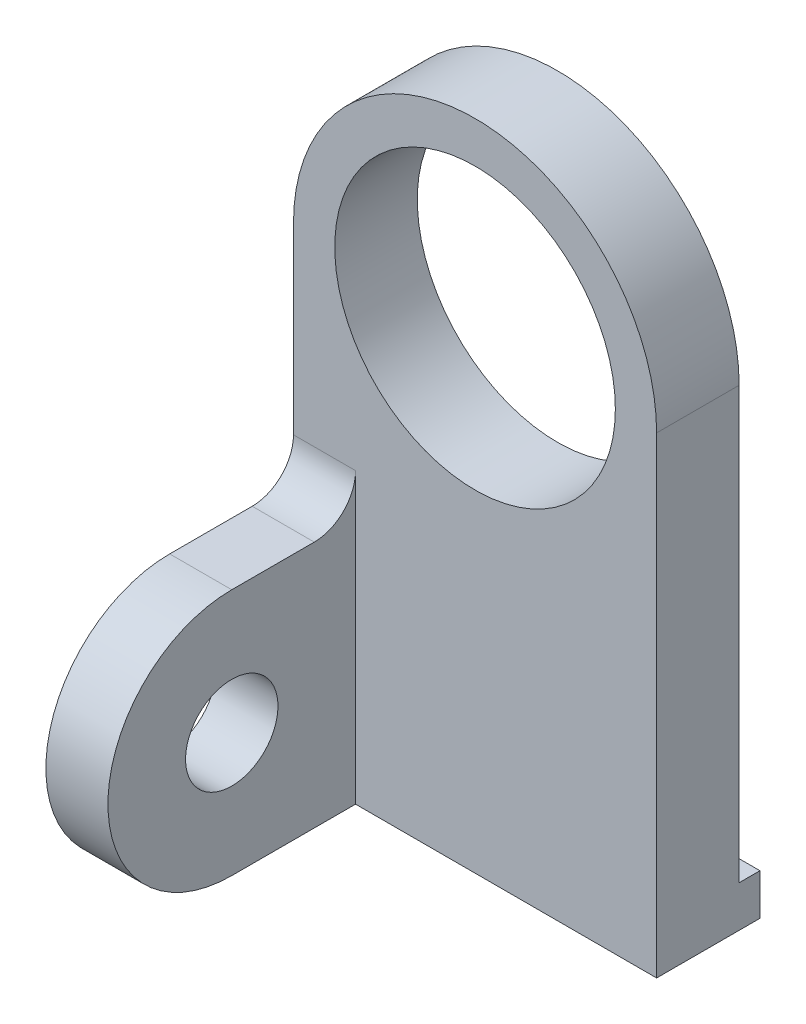
ISO-10303-21;
HEADER;
FILE_DESCRIPTION(('STEP AP214'),'2;1');
FILE_NAME('part.step','',(''),(''),'','','');
FILE_SCHEMA(('AUTOMOTIVE_DESIGN { 1 0 10303 214 1 1 1 1 }'));
ENDSEC;
DATA;
#1=APPLICATION_CONTEXT('core data for automotive mechanical design processes');
#2=APPLICATION_PROTOCOL_DEFINITION('international standard','automotive_design',2000,#1);
#3=PRODUCT_CONTEXT('',#1,'mechanical');
#4=PRODUCT('Part','Part','',(#3));
#5=PRODUCT_RELATED_PRODUCT_CATEGORY('part','',(#4));
#6=PRODUCT_DEFINITION_FORMATION('','',#4);
#7=PRODUCT_DEFINITION_CONTEXT('part definition',#1,'design');
#8=PRODUCT_DEFINITION('design','',#6,#7);
#9=PRODUCT_DEFINITION_SHAPE('','',#8);
#10=(LENGTH_UNIT() NAMED_UNIT(*) SI_UNIT(.MILLI.,.METRE.));
#11=(NAMED_UNIT(*) PLANE_ANGLE_UNIT() SI_UNIT($,.RADIAN.));
#12=(NAMED_UNIT(*) SI_UNIT($,.STERADIAN.) SOLID_ANGLE_UNIT());
#13=UNCERTAINTY_MEASURE_WITH_UNIT(LENGTH_MEASURE(1.E-05),#10,'distance_accuracy_value','');
#14=(GEOMETRIC_REPRESENTATION_CONTEXT(3) GLOBAL_UNCERTAINTY_ASSIGNED_CONTEXT((#13)) GLOBAL_UNIT_ASSIGNED_CONTEXT((#10,
#11,#12)) REPRESENTATION_CONTEXT('',''));
#15=CARTESIAN_POINT('',(0.,0.,0.));
#16=DIRECTION('',(0.,0.,1.));
#17=DIRECTION('',(1.,0.,0.));
#18=AXIS2_PLACEMENT_3D('',#15,#16,#17);
#19=CARTESIAN_POINT('',(0.,0.,6.35));
#20=DIRECTION('',(0.,0.,1.));
#21=DIRECTION('',(1.,0.,0.));
#22=AXIS2_PLACEMENT_3D('',#19,#20,#21);
#23=PLANE('',#22);
#24=DIRECTION('',(0.,-1.,0.));
#25=VECTOR('',#24,1.);
#26=CARTESIAN_POINT('',(-13.97,0.,6.35));
#27=LINE('',#26,#25);
#28=CARTESIAN_POINT('',(-13.97,0.,6.35));
#29=VERTEX_POINT('',#28);
#30=CARTESIAN_POINT('',(-13.97,-14.097,6.35));
#31=VERTEX_POINT('',#30);
#32=EDGE_CURVE('E177',#29,#31,#27,.T.);
#33=ORIENTED_EDGE('',*,*,#32,.T.);
#34=DIRECTION('',(-1.,0.,0.));
#35=VECTOR('',#34,1.);
#36=CARTESIAN_POINT('',(-9.1948,-14.097,6.35));
#37=LINE('',#36,#35);
#38=CARTESIAN_POINT('',(-9.1948,-14.097,6.35));
#39=VERTEX_POINT('',#38);
#40=EDGE_CURVE('E198',#31,#39,#37,.F.);
#41=ORIENTED_EDGE('',*,*,#40,.T.);
#42=DIRECTION('',(0.,-1.,0.));
#43=VECTOR('',#42,1.);
#44=CARTESIAN_POINT('',(-9.1948,-17.272,6.35));
#45=LINE('',#44,#43);
#46=CARTESIAN_POINT('',(-9.1948,-36.322,6.35));
#47=VERTEX_POINT('',#46);
#48=EDGE_CURVE('E47',#39,#47,#45,.T.);
#49=ORIENTED_EDGE('',*,*,#48,.T.);
#50=DIRECTION('',(1.,0.,0.));
#51=VECTOR('',#50,1.);
#52=CARTESIAN_POINT('',(-13.97,-36.322,6.35));
#53=LINE('',#52,#51);
#54=CARTESIAN_POINT('',(13.97,-36.322,6.35));
#55=VERTEX_POINT('',#54);
#56=EDGE_CURVE('E141',#47,#55,#53,.T.);
#57=ORIENTED_EDGE('',*,*,#56,.T.);
#58=DIRECTION('',(0.,1.,0.));
#59=VECTOR('',#58,1.);
#60=CARTESIAN_POINT('',(13.97,0.,6.35));
#61=LINE('',#60,#59);
#62=CARTESIAN_POINT('',(13.97,0.,6.35));
#63=VERTEX_POINT('',#62);
#64=EDGE_CURVE('E180',#55,#63,#61,.T.);
#65=ORIENTED_EDGE('',*,*,#64,.T.);
#66=CARTESIAN_POINT('',(0.,0.,6.35));
#67=DIRECTION('',(0.,0.,1.));
#68=DIRECTION('',(1.,0.,0.));
#69=AXIS2_PLACEMENT_3D('',#66,#67,#68);
#70=CIRCLE('',#69,13.97);
#71=EDGE_CURVE('E174',#63,#29,#70,.T.);
#72=ORIENTED_EDGE('',*,*,#71,.T.);
#73=EDGE_LOOP('',(#33,#41,#49,#57,#65,#72));
#74=FACE_BOUND('',#73,.T.);
#75=CARTESIAN_POINT('',(0.,0.,6.35));
#76=DIRECTION('',(0.,0.,1.));
#77=DIRECTION('',(1.,0.,0.));
#78=AXIS2_PLACEMENT_3D('',#75,#76,#77);
#79=CIRCLE('',#78,10.795);
#80=CARTESIAN_POINT('',(10.795,0.,6.35));
#81=VERTEX_POINT('',#80);
#82=EDGE_CURVE('E168',#81,#81,#79,.T.);
#83=ORIENTED_EDGE('',*,*,#82,.F.);
#84=EDGE_LOOP('',(#83));
#85=FACE_BOUND('',#84,.T.);
#86=ADVANCED_FACE('F33',(#74,#85),#23,.T.);
#87=CARTESIAN_POINT('',(0.,0.,0.));
#88=DIRECTION('',(0.,0.,1.));
#89=DIRECTION('',(1.,0.,0.));
#90=AXIS2_PLACEMENT_3D('',#87,#88,#89);
#91=PLANE('',#90);
#92=CARTESIAN_POINT('',(0.,0.,0.));
#93=DIRECTION('',(0.,0.,1.));
#94=DIRECTION('',(1.,0.,0.));
#95=AXIS2_PLACEMENT_3D('',#92,#93,#94);
#96=CIRCLE('',#95,13.97);
#97=CARTESIAN_POINT('',(13.97,0.,0.));
#98=VERTEX_POINT('',#97);
#99=CARTESIAN_POINT('',(-13.97,0.,0.));
#100=VERTEX_POINT('',#99);
#101=EDGE_CURVE('E171',#98,#100,#96,.T.);
#102=ORIENTED_EDGE('',*,*,#101,.F.);
#103=DIRECTION('',(0.,1.,0.));
#104=VECTOR('',#103,1.);
#105=CARTESIAN_POINT('',(13.97,0.,0.));
#106=LINE('',#105,#104);
#107=CARTESIAN_POINT('',(13.97,-33.147,0.));
#108=VERTEX_POINT('',#107);
#109=EDGE_CURVE('E178',#108,#98,#106,.T.);
#110=ORIENTED_EDGE('',*,*,#109,.F.);
#111=DIRECTION('',(1.,0.,0.));
#112=VECTOR('',#111,1.);
#113=CARTESIAN_POINT('',(-13.97,-33.147,0.));
#114=LINE('',#113,#112);
#115=CARTESIAN_POINT('',(-13.97,-33.147,0.));
#116=VERTEX_POINT('',#115);
#117=EDGE_CURVE('E187',#116,#108,#114,.T.);
#118=ORIENTED_EDGE('',*,*,#117,.F.);
#119=DIRECTION('',(0.,-1.,0.));
#120=VECTOR('',#119,1.);
#121=CARTESIAN_POINT('',(-13.97,0.,0.));
#122=LINE('',#121,#120);
#123=EDGE_CURVE('E185',#100,#116,#122,.T.);
#124=ORIENTED_EDGE('',*,*,#123,.F.);
#125=EDGE_LOOP('',(#102,#110,#118,#124));
#126=FACE_BOUND('',#125,.T.);
#127=CARTESIAN_POINT('',(0.,0.,0.));
#128=DIRECTION('',(0.,0.,1.));
#129=DIRECTION('',(1.,0.,0.));
#130=AXIS2_PLACEMENT_3D('',#127,#128,#129);
#131=CIRCLE('',#130,10.795);
#132=CARTESIAN_POINT('',(10.795,0.,0.));
#133=VERTEX_POINT('',#132);
#134=EDGE_CURVE('E160',#133,#133,#131,.T.);
#135=ORIENTED_EDGE('',*,*,#134,.T.);
#136=EDGE_LOOP('',(#135));
#137=FACE_BOUND('',#136,.T.);
#138=ADVANCED_FACE('F222',(#126,#137),#91,.F.);
#139=CARTESIAN_POINT('',(0.,0.,6.35));
#140=DIRECTION('',(0.,0.,-1.));
#141=DIRECTION('',(-1.,0.,0.));
#142=AXIS2_PLACEMENT_3D('',#139,#140,#141);
#143=CYLINDRICAL_SURFACE('',#142,13.97);
#144=ORIENTED_EDGE('',*,*,#101,.T.);
#145=DIRECTION('',(0.,0.,-1.));
#146=VECTOR('',#145,1.);
#147=CARTESIAN_POINT('',(-13.97,0.,6.35));
#148=LINE('',#147,#146);
#149=EDGE_CURVE('E193',#29,#100,#148,.T.);
#150=ORIENTED_EDGE('',*,*,#149,.F.);
#151=ORIENTED_EDGE('',*,*,#71,.F.);
#152=DIRECTION('',(0.,0.,-1.));
#153=VECTOR('',#152,1.);
#154=CARTESIAN_POINT('',(13.97,0.,6.35));
#155=LINE('',#154,#153);
#156=EDGE_CURVE('E182',#63,#98,#155,.T.);
#157=ORIENTED_EDGE('',*,*,#156,.T.);
#158=EDGE_LOOP('',(#144,#150,#151,#157));
#159=FACE_BOUND('',#158,.T.);
#160=ADVANCED_FACE('F219',(#159),#143,.T.);
#161=CARTESIAN_POINT('',(-13.97,0.,6.35));
#162=DIRECTION('',(1.,0.,0.));
#163=DIRECTION('',(0.,0.,-1.));
#164=AXIS2_PLACEMENT_3D('',#161,#162,#163);
#165=PLANE('',#164);
#166=ORIENTED_EDGE('',*,*,#123,.T.);
#167=DIRECTION('',(0.,0.,1.));
#168=VECTOR('',#167,1.);
#169=CARTESIAN_POINT('',(-13.97,-33.147,-1.6002));
#170=LINE('',#169,#168);
#171=CARTESIAN_POINT('',(-13.97,-33.147,-1.6002));
#172=VERTEX_POINT('',#171);
#173=EDGE_CURVE('E157',#172,#116,#170,.T.);
#174=ORIENTED_EDGE('',*,*,#173,.F.);
#175=DIRECTION('',(0.,-1.,0.));
#176=VECTOR('',#175,1.);
#177=CARTESIAN_POINT('',(-13.97,-33.147,-1.6002));
#178=LINE('',#177,#176);
#179=CARTESIAN_POINT('',(-13.97,-36.322,-1.6002));
#180=VERTEX_POINT('',#179);
#181=EDGE_CURVE('E143',#172,#180,#178,.T.);
#182=ORIENTED_EDGE('',*,*,#181,.T.);
#183=DIRECTION('',(0.,0.,1.));
#184=VECTOR('',#183,1.);
#185=CARTESIAN_POINT('',(-13.97,-36.322,-1.6002));
#186=LINE('',#185,#184);
#187=CARTESIAN_POINT('',(-13.97,-36.322,15.875));
#188=VERTEX_POINT('',#187);
#189=EDGE_CURVE('E155',#180,#188,#186,.T.);
#190=ORIENTED_EDGE('',*,*,#189,.T.);
#191=CARTESIAN_POINT('',(-13.97,-26.797,15.875));
#192=DIRECTION('',(-1.,0.,0.));
#193=DIRECTION('',(0.,0.,1.));
#194=AXIS2_PLACEMENT_3D('',#191,#192,#193);
#195=CIRCLE('',#194,9.525);
#196=CARTESIAN_POINT('',(-13.97,-17.272,15.875));
#197=VERTEX_POINT('',#196);
#198=EDGE_CURVE('E131',#188,#197,#195,.T.);
#199=ORIENTED_EDGE('',*,*,#198,.T.);
#200=DIRECTION('',(0.,0.,-1.));
#201=VECTOR('',#200,1.);
#202=CARTESIAN_POINT('',(-13.97,-17.272,15.875));
#203=LINE('',#202,#201);
#204=CARTESIAN_POINT('',(-13.97,-17.272,9.525));
#205=VERTEX_POINT('',#204);
#206=EDGE_CURVE('E114',#197,#205,#203,.T.);
#207=ORIENTED_EDGE('',*,*,#206,.T.);
#208=CARTESIAN_POINT('',(-13.97,-14.097,9.525));
#209=DIRECTION('',(1.,0.,0.));
#210=DIRECTION('',(0.,0.,-1.));
#211=AXIS2_PLACEMENT_3D('',#208,#209,#210);
#212=CIRCLE('',#211,3.175);
#213=EDGE_CURVE('E41',#205,#31,#212,.T.);
#214=ORIENTED_EDGE('',*,*,#213,.T.);
#215=ORIENTED_EDGE('',*,*,#32,.F.);
#216=ORIENTED_EDGE('',*,*,#149,.T.);
#217=EDGE_LOOP('',(#166,#174,#182,#190,#199,#207,#214,#215,#216));
#218=FACE_BOUND('',#217,.T.);
#219=CARTESIAN_POINT('',(-13.97,-26.797,15.875));
#220=DIRECTION('',(-1.,0.,0.));
#221=DIRECTION('',(0.,0.,1.));
#222=AXIS2_PLACEMENT_3D('',#219,#220,#221);
#223=CIRCLE('',#222,3.556);
#224=CARTESIAN_POINT('',(-13.97,-26.797,19.431));
#225=VERTEX_POINT('',#224);
#226=EDGE_CURVE('E134',#225,#225,#223,.T.);
#227=ORIENTED_EDGE('',*,*,#226,.F.);
#228=EDGE_LOOP('',(#227));
#229=FACE_BOUND('',#228,.T.);
#230=ADVANCED_FACE('F204',(#218,#229),#165,.F.);
#231=CARTESIAN_POINT('',(13.97,0.,6.35));
#232=DIRECTION('',(-1.,0.,0.));
#233=DIRECTION('',(0.,0.,1.));
#234=AXIS2_PLACEMENT_3D('',#231,#232,#233);
#235=PLANE('',#234);
#236=ORIENTED_EDGE('',*,*,#109,.T.);
#237=ORIENTED_EDGE('',*,*,#156,.F.);
#238=ORIENTED_EDGE('',*,*,#64,.F.);
#239=DIRECTION('',(0.,0.,1.));
#240=VECTOR('',#239,1.);
#241=CARTESIAN_POINT('',(13.97,-36.322,-1.6002));
#242=LINE('',#241,#240);
#243=CARTESIAN_POINT('',(13.97,-36.322,-1.6002));
#244=VERTEX_POINT('',#243);
#245=EDGE_CURVE('E164',#244,#55,#242,.T.);
#246=ORIENTED_EDGE('',*,*,#245,.F.);
#247=DIRECTION('',(0.,1.,0.));
#248=VECTOR('',#247,1.);
#249=CARTESIAN_POINT('',(13.97,-33.147,-1.6002));
#250=LINE('',#249,#248);
#251=CARTESIAN_POINT('',(13.97,-33.147,-1.6002));
#252=VERTEX_POINT('',#251);
#253=EDGE_CURVE('E149',#244,#252,#250,.T.);
#254=ORIENTED_EDGE('',*,*,#253,.T.);
#255=DIRECTION('',(0.,0.,1.));
#256=VECTOR('',#255,1.);
#257=CARTESIAN_POINT('',(13.97,-33.147,-1.6002));
#258=LINE('',#257,#256);
#259=EDGE_CURVE('E161',#252,#108,#258,.T.);
#260=ORIENTED_EDGE('',*,*,#259,.T.);
#261=EDGE_LOOP('',(#236,#237,#238,#246,#254,#260));
#262=FACE_BOUND('',#261,.T.);
#263=ADVANCED_FACE('F213',(#262),#235,.F.);
#264=CARTESIAN_POINT('',(0.,0.,6.35));
#265=DIRECTION('',(0.,0.,-1.));
#266=DIRECTION('',(-1.,0.,0.));
#267=AXIS2_PLACEMENT_3D('',#264,#265,#266);
#268=CYLINDRICAL_SURFACE('',#267,10.795);
#269=ORIENTED_EDGE('',*,*,#82,.T.);
#270=EDGE_LOOP('',(#269));
#271=FACE_BOUND('',#270,.T.);
#272=ORIENTED_EDGE('',*,*,#134,.F.);
#273=EDGE_LOOP('',(#272));
#274=FACE_BOUND('',#273,.T.);
#275=ADVANCED_FACE('F249',(#271,#274),#268,.F.);
#276=CARTESIAN_POINT('',(-13.97,-33.147,-1.6002));
#277=DIRECTION('',(0.,1.,0.));
#278=DIRECTION('',(0.,0.,1.));
#279=AXIS2_PLACEMENT_3D('',#276,#277,#278);
#280=PLANE('',#279);
#281=ORIENTED_EDGE('',*,*,#173,.T.);
#282=ORIENTED_EDGE('',*,*,#117,.T.);
#283=ORIENTED_EDGE('',*,*,#259,.F.);
#284=DIRECTION('',(-1.,0.,0.));
#285=VECTOR('',#284,1.);
#286=CARTESIAN_POINT('',(-13.97,-33.147,-1.6002));
#287=LINE('',#286,#285);
#288=EDGE_CURVE('E152',#252,#172,#287,.T.);
#289=ORIENTED_EDGE('',*,*,#288,.T.);
#290=EDGE_LOOP('',(#281,#282,#283,#289));
#291=FACE_BOUND('',#290,.T.);
#292=ADVANCED_FACE('F225',(#291),#280,.T.);
#293=CARTESIAN_POINT('',(-13.97,-36.322,-1.6002));
#294=DIRECTION('',(0.,-1.,0.));
#295=DIRECTION('',(0.,0.,-1.));
#296=AXIS2_PLACEMENT_3D('',#293,#294,#295);
#297=PLANE('',#296);
#298=ORIENTED_EDGE('',*,*,#56,.F.);
#299=DIRECTION('',(0.,0.,1.));
#300=VECTOR('',#299,1.);
#301=CARTESIAN_POINT('',(-9.1948,-36.322,6.35));
#302=LINE('',#301,#300);
#303=CARTESIAN_POINT('',(-9.1948,-36.322,15.875));
#304=VERTEX_POINT('',#303);
#305=EDGE_CURVE('E120',#47,#304,#302,.T.);
#306=ORIENTED_EDGE('',*,*,#305,.T.);
#307=DIRECTION('',(-1.,0.,0.));
#308=VECTOR('',#307,1.);
#309=CARTESIAN_POINT('',(-9.1948,-36.322,15.875));
#310=LINE('',#309,#308);
#311=EDGE_CURVE('E119',#304,#188,#310,.T.);
#312=ORIENTED_EDGE('',*,*,#311,.T.);
#313=ORIENTED_EDGE('',*,*,#189,.F.);
#314=DIRECTION('',(1.,0.,0.));
#315=VECTOR('',#314,1.);
#316=CARTESIAN_POINT('',(-13.97,-36.322,-1.6002));
#317=LINE('',#316,#315);
#318=EDGE_CURVE('E146',#180,#244,#317,.T.);
#319=ORIENTED_EDGE('',*,*,#318,.T.);
#320=ORIENTED_EDGE('',*,*,#245,.T.);
#321=EDGE_LOOP('',(#298,#306,#312,#313,#319,#320));
#322=FACE_BOUND('',#321,.T.);
#323=ADVANCED_FACE('F209',(#322),#297,.T.);
#324=CARTESIAN_POINT('',(0.,0.,-1.6002));
#325=DIRECTION('',(0.,0.,1.));
#326=DIRECTION('',(1.,0.,0.));
#327=AXIS2_PLACEMENT_3D('',#324,#325,#326);
#328=PLANE('',#327);
#329=ORIENTED_EDGE('',*,*,#181,.F.);
#330=ORIENTED_EDGE('',*,*,#288,.F.);
#331=ORIENTED_EDGE('',*,*,#253,.F.);
#332=ORIENTED_EDGE('',*,*,#318,.F.);
#333=EDGE_LOOP('',(#329,#330,#331,#332));
#334=FACE_BOUND('',#333,.T.);
#335=ADVANCED_FACE('F228',(#334),#328,.F.);
#336=CARTESIAN_POINT('',(-9.1948,-26.797,15.875));
#337=DIRECTION('',(-1.,0.,0.));
#338=DIRECTION('',(0.,0.,1.));
#339=AXIS2_PLACEMENT_3D('',#336,#337,#338);
#340=CYLINDRICAL_SURFACE('',#339,9.525);
#341=ORIENTED_EDGE('',*,*,#198,.F.);
#342=ORIENTED_EDGE('',*,*,#311,.F.);
#343=CARTESIAN_POINT('',(-9.1948,-26.797,15.875));
#344=DIRECTION('',(-1.,0.,0.));
#345=DIRECTION('',(0.,0.,1.));
#346=AXIS2_PLACEMENT_3D('',#343,#344,#345);
#347=CIRCLE('',#346,9.525);
#348=CARTESIAN_POINT('',(-9.1948,-17.272,15.875));
#349=VERTEX_POINT('',#348);
#350=EDGE_CURVE('E124',#304,#349,#347,.T.);
#351=ORIENTED_EDGE('',*,*,#350,.T.);
#352=DIRECTION('',(-1.,0.,0.));
#353=VECTOR('',#352,1.);
#354=CARTESIAN_POINT('',(-9.1948,-17.272,15.875));
#355=LINE('',#354,#353);
#356=EDGE_CURVE('E108',#349,#197,#355,.T.);
#357=ORIENTED_EDGE('',*,*,#356,.T.);
#358=EDGE_LOOP('',(#341,#342,#351,#357));
#359=FACE_BOUND('',#358,.T.);
#360=ADVANCED_FACE('F128',(#359),#340,.T.);
#361=CARTESIAN_POINT('',(-9.1948,-17.272,15.875));
#362=DIRECTION('',(0.,1.,0.));
#363=DIRECTION('',(0.,0.,1.));
#364=AXIS2_PLACEMENT_3D('',#361,#362,#363);
#365=PLANE('',#364);
#366=DIRECTION('',(0.,0.,-1.));
#367=VECTOR('',#366,1.);
#368=CARTESIAN_POINT('',(-9.1948,-17.272,15.875));
#369=LINE('',#368,#367);
#370=CARTESIAN_POINT('',(-9.1948,-17.272,9.525));
#371=VERTEX_POINT('',#370);
#372=EDGE_CURVE('E112',#349,#371,#369,.T.);
#373=ORIENTED_EDGE('',*,*,#372,.T.);
#374=DIRECTION('',(-1.,0.,0.));
#375=VECTOR('',#374,1.);
#376=CARTESIAN_POINT('',(-13.97,-17.272,9.525));
#377=LINE('',#376,#375);
#378=EDGE_CURVE('E196',#371,#205,#377,.T.);
#379=ORIENTED_EDGE('',*,*,#378,.T.);
#380=ORIENTED_EDGE('',*,*,#206,.F.);
#381=ORIENTED_EDGE('',*,*,#356,.F.);
#382=EDGE_LOOP('',(#373,#379,#380,#381));
#383=FACE_BOUND('',#382,.T.);
#384=ADVANCED_FACE('F110',(#383),#365,.T.);
#385=CARTESIAN_POINT('',(-9.1948,-26.797,15.875));
#386=DIRECTION('',(-1.,0.,0.));
#387=DIRECTION('',(0.,0.,1.));
#388=AXIS2_PLACEMENT_3D('',#385,#386,#387);
#389=PLANE('',#388);
#390=CARTESIAN_POINT('',(-9.1948,-26.797,15.875));
#391=DIRECTION('',(-1.,0.,0.));
#392=DIRECTION('',(0.,0.,1.));
#393=AXIS2_PLACEMENT_3D('',#390,#391,#392);
#394=CIRCLE('',#393,3.556);
#395=CARTESIAN_POINT('',(-9.1948,-26.797,19.431));
#396=VERTEX_POINT('',#395);
#397=EDGE_CURVE('E139',#396,#396,#394,.T.);
#398=ORIENTED_EDGE('',*,*,#397,.T.);
#399=EDGE_LOOP('',(#398));
#400=FACE_BOUND('',#399,.T.);
#401=ORIENTED_EDGE('',*,*,#350,.F.);
#402=ORIENTED_EDGE('',*,*,#305,.F.);
#403=ORIENTED_EDGE('',*,*,#48,.F.);
#404=CARTESIAN_POINT('',(-9.1948,-14.097,9.525));
#405=DIRECTION('',(-1.,0.,0.));
#406=DIRECTION('',(0.,0.,1.));
#407=AXIS2_PLACEMENT_3D('',#404,#405,#406);
#408=CIRCLE('',#407,3.175);
#409=EDGE_CURVE('E11',#39,#371,#408,.T.);
#410=ORIENTED_EDGE('',*,*,#409,.T.);
#411=ORIENTED_EDGE('',*,*,#372,.F.);
#412=EDGE_LOOP('',(#401,#402,#403,#410,#411));
#413=FACE_BOUND('',#412,.T.);
#414=ADVANCED_FACE('F123',(#400,#413),#389,.F.);
#415=CARTESIAN_POINT('',(-9.1948,-26.797,15.875));
#416=DIRECTION('',(-1.,0.,0.));
#417=DIRECTION('',(0.,0.,1.));
#418=AXIS2_PLACEMENT_3D('',#415,#416,#417);
#419=CYLINDRICAL_SURFACE('',#418,3.556);
#420=ORIENTED_EDGE('',*,*,#397,.F.);
#421=EDGE_LOOP('',(#420));
#422=FACE_BOUND('',#421,.T.);
#423=ORIENTED_EDGE('',*,*,#226,.T.);
#424=EDGE_LOOP('',(#423));
#425=FACE_BOUND('',#424,.T.);
#426=ADVANCED_FACE('F296',(#422,#425),#419,.F.);
#427=CARTESIAN_POINT('',(-9.1948,-14.097,9.525));
#428=DIRECTION('',(1.,0.,0.));
#429=DIRECTION('',(0.,0.,-1.));
#430=AXIS2_PLACEMENT_3D('',#427,#428,#429);
#431=CYLINDRICAL_SURFACE('',#430,3.175);
#432=ORIENTED_EDGE('',*,*,#409,.F.);
#433=ORIENTED_EDGE('',*,*,#40,.F.);
#434=ORIENTED_EDGE('',*,*,#213,.F.);
#435=ORIENTED_EDGE('',*,*,#378,.F.);
#436=EDGE_LOOP('',(#432,#433,#434,#435));
#437=FACE_BOUND('',#436,.T.);
#438=ADVANCED_FACE('F35',(#437),#431,.F.);
#439=CLOSED_SHELL('',(#86,#138,#160,#230,#263,#275,#292,#323,#335,#360,#384,#414,#426,#438));
#440=MANIFOLD_SOLID_BREP('B2',#439);
#441=ADVANCED_BREP_SHAPE_REPRESENTATION('',(#18,#440),#14);
#442=SHAPE_DEFINITION_REPRESENTATION(#9,#441);
ENDSEC;
END-ISO-10303-21;
